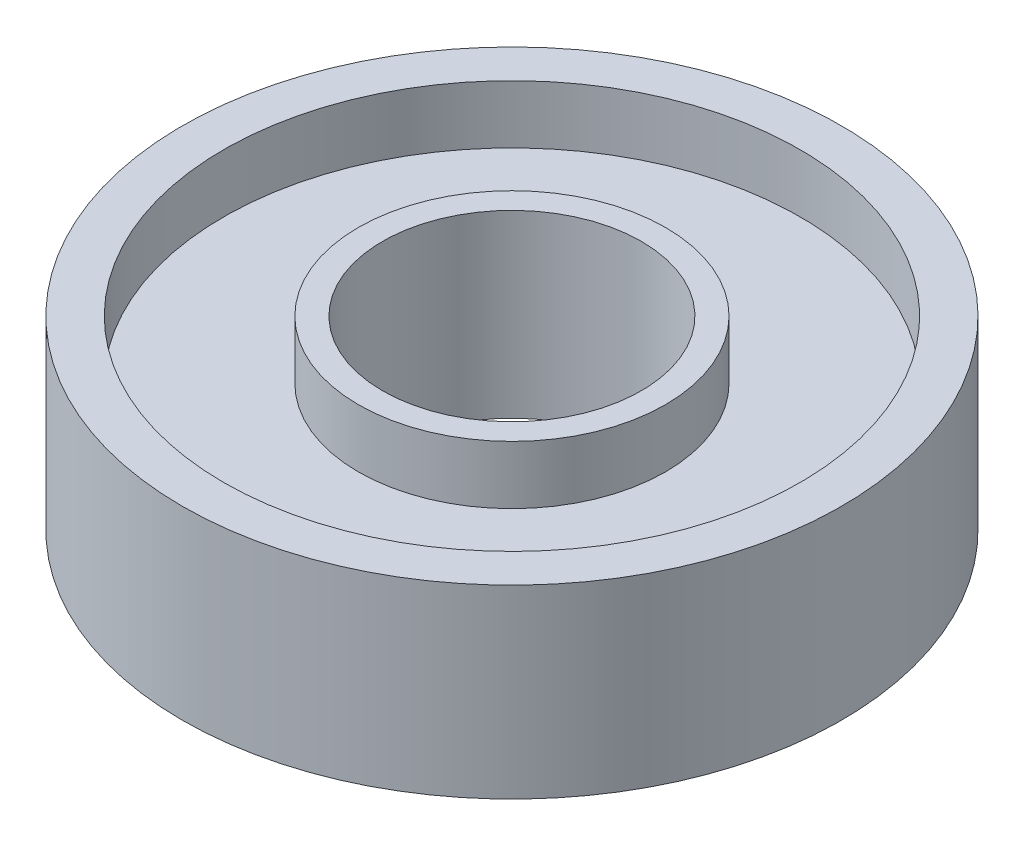
ISO-10303-21;
HEADER;
FILE_DESCRIPTION(('STEP AP214'),'2;1');
FILE_NAME('part.step','',(''),(''),'','','');
FILE_SCHEMA(('AUTOMOTIVE_DESIGN { 1 0 10303 214 1 1 1 1 }'));
ENDSEC;
DATA;
#1=APPLICATION_CONTEXT('core data for automotive mechanical design processes');
#2=APPLICATION_PROTOCOL_DEFINITION('international standard','automotive_design',2000,#1);
#3=PRODUCT_CONTEXT('',#1,'mechanical');
#4=PRODUCT('Part','Part','',(#3));
#5=PRODUCT_RELATED_PRODUCT_CATEGORY('part','',(#4));
#6=PRODUCT_DEFINITION_FORMATION('','',#4);
#7=PRODUCT_DEFINITION_CONTEXT('part definition',#1,'design');
#8=PRODUCT_DEFINITION('design','',#6,#7);
#9=PRODUCT_DEFINITION_SHAPE('','',#8);
#10=(LENGTH_UNIT() NAMED_UNIT(*) SI_UNIT(.MILLI.,.METRE.));
#11=(NAMED_UNIT(*) PLANE_ANGLE_UNIT() SI_UNIT($,.RADIAN.));
#12=(NAMED_UNIT(*) SI_UNIT($,.STERADIAN.) SOLID_ANGLE_UNIT());
#13=UNCERTAINTY_MEASURE_WITH_UNIT(LENGTH_MEASURE(1.E-05),#10,'distance_accuracy_value','');
#14=(GEOMETRIC_REPRESENTATION_CONTEXT(3) GLOBAL_UNCERTAINTY_ASSIGNED_CONTEXT((#13)) GLOBAL_UNIT_ASSIGNED_CONTEXT((#10,
#11,#12)) REPRESENTATION_CONTEXT('',''));
#15=CARTESIAN_POINT('',(0.,0.,0.));
#16=DIRECTION('',(0.,0.,1.));
#17=DIRECTION('',(1.,0.,0.));
#18=AXIS2_PLACEMENT_3D('',#15,#16,#17);
#19=CARTESIAN_POINT('',(0.,0.,0.));
#20=DIRECTION('',(0.,1.,0.));
#21=DIRECTION('',(0.,0.,1.));
#22=AXIS2_PLACEMENT_3D('',#19,#20,#21);
#23=CYLINDRICAL_SURFACE('',#22,4.89);
#24=CARTESIAN_POINT('',(0.,7.,0.));
#25=DIRECTION('',(0.,1.,0.));
#26=DIRECTION('',(0.,0.,1.));
#27=AXIS2_PLACEMENT_3D('',#24,#25,#26);
#28=CIRCLE('',#27,4.89);
#29=CARTESIAN_POINT('',(0.,7.,4.89));
#30=VERTEX_POINT('',#29);
#31=EDGE_CURVE('E47',#30,#30,#28,.T.);
#32=ORIENTED_EDGE('',*,*,#31,.T.);
#33=EDGE_LOOP('',(#32));
#34=FACE_BOUND('',#33,.T.);
#35=CARTESIAN_POINT('',(0.,0.2,0.));
#36=DIRECTION('',(0.,-1.,0.));
#37=DIRECTION('',(0.,0.,-1.));
#38=AXIS2_PLACEMENT_3D('',#35,#36,#37);
#39=CIRCLE('',#38,4.89);
#40=CARTESIAN_POINT('',(0.,0.2,-4.89));
#41=VERTEX_POINT('',#40);
#42=EDGE_CURVE('E38',#41,#41,#39,.F.);
#43=ORIENTED_EDGE('',*,*,#42,.F.);
#44=EDGE_LOOP('',(#43));
#45=FACE_BOUND('',#44,.T.);
#46=ADVANCED_FACE('F34',(#34,#45),#23,.F.);
#47=CARTESIAN_POINT('',(0.,7.,0.));
#48=DIRECTION('',(0.,1.,0.));
#49=DIRECTION('',(0.,0.,1.));
#50=AXIS2_PLACEMENT_3D('',#47,#48,#49);
#51=PLANE('',#50);
#52=ORIENTED_EDGE('',*,*,#31,.F.);
#53=EDGE_LOOP('',(#52));
#54=FACE_BOUND('',#53,.T.);
#55=CARTESIAN_POINT('',(0.,7.,0.));
#56=DIRECTION('',(0.,1.,0.));
#57=DIRECTION('',(0.,0.,1.));
#58=AXIS2_PLACEMENT_3D('',#55,#56,#57);
#59=CIRCLE('',#58,5.8);
#60=CARTESIAN_POINT('',(0.,7.,5.8));
#61=VERTEX_POINT('',#60);
#62=EDGE_CURVE('E58',#61,#61,#59,.T.);
#63=ORIENTED_EDGE('',*,*,#62,.T.);
#64=EDGE_LOOP('',(#63));
#65=FACE_BOUND('',#64,.T.);
#66=ADVANCED_FACE('F76',(#54,#65),#51,.T.);
#67=CARTESIAN_POINT('',(0.,7.,0.));
#68=DIRECTION('',(0.,-1.,0.));
#69=DIRECTION('',(0.,0.,-1.));
#70=AXIS2_PLACEMENT_3D('',#67,#68,#69);
#71=CYLINDRICAL_SURFACE('',#70,12.45);
#72=CARTESIAN_POINT('',(0.,7.,0.));
#73=DIRECTION('',(0.,1.,0.));
#74=DIRECTION('',(0.,0.,1.));
#75=AXIS2_PLACEMENT_3D('',#72,#73,#74);
#76=CIRCLE('',#75,12.45);
#77=CARTESIAN_POINT('',(0.,7.,12.45));
#78=VERTEX_POINT('',#77);
#79=EDGE_CURVE('E10',#78,#78,#76,.T.);
#80=ORIENTED_EDGE('',*,*,#79,.F.);
#81=EDGE_LOOP('',(#80));
#82=FACE_BOUND('',#81,.T.);
#83=CARTESIAN_POINT('',(0.,0.,0.));
#84=DIRECTION('',(0.,1.,0.));
#85=DIRECTION('',(0.,0.,1.));
#86=AXIS2_PLACEMENT_3D('',#83,#84,#85);
#87=CIRCLE('',#86,12.45);
#88=CARTESIAN_POINT('',(0.,0.,12.45));
#89=VERTEX_POINT('',#88);
#90=EDGE_CURVE('E42',#89,#89,#87,.T.);
#91=ORIENTED_EDGE('',*,*,#90,.T.);
#92=EDGE_LOOP('',(#91));
#93=FACE_BOUND('',#92,.T.);
#94=ADVANCED_FACE('F36',(#82,#93),#71,.T.);
#95=CARTESIAN_POINT('',(0.,7.,0.));
#96=DIRECTION('',(0.,1.,0.));
#97=DIRECTION('',(0.,0.,1.));
#98=AXIS2_PLACEMENT_3D('',#95,#96,#97);
#99=CIRCLE('',#98,10.89);
#100=CARTESIAN_POINT('',(0.,7.,10.89));
#101=VERTEX_POINT('',#100);
#102=EDGE_CURVE('E52',#101,#101,#99,.T.);
#103=ORIENTED_EDGE('',*,*,#102,.F.);
#104=EDGE_LOOP('',(#103));
#105=FACE_BOUND('',#104,.T.);
#106=ORIENTED_EDGE('',*,*,#79,.T.);
#107=EDGE_LOOP('',(#106));
#108=FACE_BOUND('',#107,.T.);
#109=ADVANCED_FACE('F84',(#105,#108),#51,.T.);
#110=CARTESIAN_POINT('',(0.,0.,0.));
#111=DIRECTION('',(0.,1.,0.));
#112=DIRECTION('',(0.,0.,1.));
#113=AXIS2_PLACEMENT_3D('',#110,#111,#112);
#114=PLANE('',#113);
#115=CARTESIAN_POINT('',(0.,0.,0.));
#116=DIRECTION('',(0.,-1.,0.));
#117=DIRECTION('',(0.,0.,-1.));
#118=AXIS2_PLACEMENT_3D('',#115,#116,#117);
#119=CIRCLE('',#118,11.15);
#120=CARTESIAN_POINT('',(0.,0.,-11.15));
#121=VERTEX_POINT('',#120);
#122=EDGE_CURVE('E63',#121,#121,#119,.T.);
#123=ORIENTED_EDGE('',*,*,#122,.F.);
#124=EDGE_LOOP('',(#123));
#125=FACE_BOUND('',#124,.T.);
#126=ORIENTED_EDGE('',*,*,#90,.F.);
#127=EDGE_LOOP('',(#126));
#128=FACE_BOUND('',#127,.T.);
#129=ADVANCED_FACE('F89',(#125,#128),#114,.F.);
#130=CARTESIAN_POINT('',(0.,4.8,0.));
#131=DIRECTION('',(0.,1.,0.));
#132=DIRECTION('',(0.,0.,1.));
#133=AXIS2_PLACEMENT_3D('',#130,#131,#132);
#134=CYLINDRICAL_SURFACE('',#133,10.89);
#135=CARTESIAN_POINT('',(0.,4.8,0.));
#136=DIRECTION('',(0.,1.,0.));
#137=DIRECTION('',(0.,0.,1.));
#138=AXIS2_PLACEMENT_3D('',#135,#136,#137);
#139=CIRCLE('',#138,10.89);
#140=CARTESIAN_POINT('',(0.,4.8,10.89));
#141=VERTEX_POINT('',#140);
#142=EDGE_CURVE('E51',#141,#141,#139,.T.);
#143=ORIENTED_EDGE('',*,*,#142,.F.);
#144=EDGE_LOOP('',(#143));
#145=FACE_BOUND('',#144,.T.);
#146=ORIENTED_EDGE('',*,*,#102,.T.);
#147=EDGE_LOOP('',(#146));
#148=FACE_BOUND('',#147,.T.);
#149=ADVANCED_FACE('F86',(#145,#148),#134,.F.);
#150=CARTESIAN_POINT('',(0.,4.8,0.));
#151=DIRECTION('',(0.,1.,0.));
#152=DIRECTION('',(0.,0.,1.));
#153=AXIS2_PLACEMENT_3D('',#150,#151,#152);
#154=PLANE('',#153);
#155=CARTESIAN_POINT('',(0.,4.8,0.));
#156=DIRECTION('',(0.,1.,0.));
#157=DIRECTION('',(0.,0.,1.));
#158=AXIS2_PLACEMENT_3D('',#155,#156,#157);
#159=CIRCLE('',#158,5.8);
#160=CARTESIAN_POINT('',(0.,4.8,5.8));
#161=VERTEX_POINT('',#160);
#162=EDGE_CURVE('E55',#161,#161,#159,.T.);
#163=ORIENTED_EDGE('',*,*,#162,.F.);
#164=EDGE_LOOP('',(#163));
#165=FACE_BOUND('',#164,.T.);
#166=ORIENTED_EDGE('',*,*,#142,.T.);
#167=EDGE_LOOP('',(#166));
#168=FACE_BOUND('',#167,.T.);
#169=ADVANCED_FACE('F96',(#165,#168),#154,.T.);
#170=CARTESIAN_POINT('',(0.,4.8,0.));
#171=DIRECTION('',(0.,1.,0.));
#172=DIRECTION('',(0.,0.,1.));
#173=AXIS2_PLACEMENT_3D('',#170,#171,#172);
#174=CYLINDRICAL_SURFACE('',#173,5.8);
#175=ORIENTED_EDGE('',*,*,#162,.T.);
#176=EDGE_LOOP('',(#175));
#177=FACE_BOUND('',#176,.T.);
#178=ORIENTED_EDGE('',*,*,#62,.F.);
#179=EDGE_LOOP('',(#178));
#180=FACE_BOUND('',#179,.T.);
#181=ADVANCED_FACE('F130',(#177,#180),#174,.T.);
#182=CARTESIAN_POINT('',(0.,0.2,0.));
#183=DIRECTION('',(0.,-1.,0.));
#184=DIRECTION('',(0.,0.,-1.));
#185=AXIS2_PLACEMENT_3D('',#182,#183,#184);
#186=PLANE('',#185);
#187=CARTESIAN_POINT('',(0.,0.2,0.));
#188=DIRECTION('',(0.,-1.,0.));
#189=DIRECTION('',(0.,0.,-1.));
#190=AXIS2_PLACEMENT_3D('',#187,#188,#189);
#191=CIRCLE('',#190,11.15);
#192=CARTESIAN_POINT('',(0.,0.2,-11.15));
#193=VERTEX_POINT('',#192);
#194=EDGE_CURVE('E66',#193,#193,#191,.T.);
#195=ORIENTED_EDGE('',*,*,#194,.T.);
#196=EDGE_LOOP('',(#195));
#197=FACE_BOUND('',#196,.T.);
#198=ORIENTED_EDGE('',*,*,#42,.T.);
#199=EDGE_LOOP('',(#198));
#200=FACE_BOUND('',#199,.T.);
#201=ADVANCED_FACE('F73',(#197,#200),#186,.T.);
#202=CARTESIAN_POINT('',(0.,0.2,0.));
#203=DIRECTION('',(0.,-1.,0.));
#204=DIRECTION('',(0.,0.,-1.));
#205=AXIS2_PLACEMENT_3D('',#202,#203,#204);
#206=CYLINDRICAL_SURFACE('',#205,11.15);
#207=ORIENTED_EDGE('',*,*,#194,.F.);
#208=EDGE_LOOP('',(#207));
#209=FACE_BOUND('',#208,.T.);
#210=ORIENTED_EDGE('',*,*,#122,.T.);
#211=EDGE_LOOP('',(#210));
#212=FACE_BOUND('',#211,.T.);
#213=ADVANCED_FACE('F155',(#209,#212),#206,.F.);
#214=CLOSED_SHELL('',(#46,#66,#94,#109,#129,#149,#169,#181,#201,#213));
#215=MANIFOLD_SOLID_BREP('B2',#214);
#216=ADVANCED_BREP_SHAPE_REPRESENTATION('',(#18,#215),#14);
#217=SHAPE_DEFINITION_REPRESENTATION(#9,#216);
ENDSEC;
END-ISO-10303-21;
